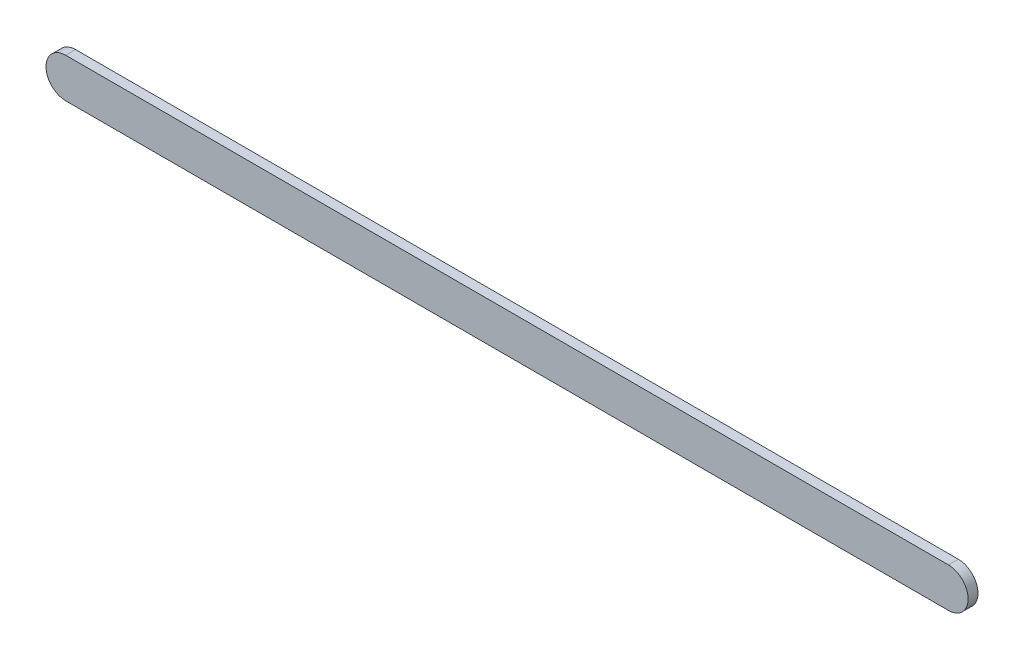
ISO-10303-21;
HEADER;
FILE_DESCRIPTION(('STEP AP214'),'2;1');
FILE_NAME('part.step','',(''),(''),'','','');
FILE_SCHEMA(('AUTOMOTIVE_DESIGN { 1 0 10303 214 1 1 1 1 }'));
ENDSEC;
DATA;
#1=APPLICATION_CONTEXT('core data for automotive mechanical design processes');
#2=APPLICATION_PROTOCOL_DEFINITION('international standard','automotive_design',2000,#1);
#3=PRODUCT_CONTEXT('',#1,'mechanical');
#4=PRODUCT('Part','Part','',(#3));
#5=PRODUCT_RELATED_PRODUCT_CATEGORY('part','',(#4));
#6=PRODUCT_DEFINITION_FORMATION('','',#4);
#7=PRODUCT_DEFINITION_CONTEXT('part definition',#1,'design');
#8=PRODUCT_DEFINITION('design','',#6,#7);
#9=PRODUCT_DEFINITION_SHAPE('','',#8);
#10=(LENGTH_UNIT() NAMED_UNIT(*) SI_UNIT(.MILLI.,.METRE.));
#11=(NAMED_UNIT(*) PLANE_ANGLE_UNIT() SI_UNIT($,.RADIAN.));
#12=(NAMED_UNIT(*) SI_UNIT($,.STERADIAN.) SOLID_ANGLE_UNIT());
#13=UNCERTAINTY_MEASURE_WITH_UNIT(LENGTH_MEASURE(1.E-05),#10,'distance_accuracy_value','');
#14=(GEOMETRIC_REPRESENTATION_CONTEXT(3) GLOBAL_UNCERTAINTY_ASSIGNED_CONTEXT((#13)) GLOBAL_UNIT_ASSIGNED_CONTEXT((#10,
#11,#12)) REPRESENTATION_CONTEXT('',''));
#15=CARTESIAN_POINT('',(0.,0.,0.));
#16=DIRECTION('',(0.,0.,1.));
#17=DIRECTION('',(1.,0.,0.));
#18=AXIS2_PLACEMENT_3D('',#15,#16,#17);
#19=CARTESIAN_POINT('',(0.,0.,5.));
#20=DIRECTION('',(0.,0.,-1.));
#21=DIRECTION('',(-1.,0.,0.));
#22=AXIS2_PLACEMENT_3D('',#19,#20,#21);
#23=CYLINDRICAL_SURFACE('',#22,20.);
#24=CARTESIAN_POINT('',(0.,0.,-5.));
#25=DIRECTION('',(0.,0.,1.));
#26=DIRECTION('',(1.,0.,0.));
#27=AXIS2_PLACEMENT_3D('',#24,#25,#26);
#28=CIRCLE('',#27,20.);
#29=CARTESIAN_POINT('',(0.,-20.,-5.));
#30=VERTEX_POINT('',#29);
#31=CARTESIAN_POINT('',(0.,20.,-5.));
#32=VERTEX_POINT('',#31);
#33=EDGE_CURVE('E97',#30,#32,#28,.T.);
#34=ORIENTED_EDGE('',*,*,#33,.T.);
#35=DIRECTION('',(0.,0.,-1.));
#36=VECTOR('',#35,1.);
#37=CARTESIAN_POINT('',(0.,20.,5.));
#38=LINE('',#37,#36);
#39=CARTESIAN_POINT('',(0.,20.,5.));
#40=VERTEX_POINT('',#39);
#41=EDGE_CURVE('E11',#40,#32,#38,.T.);
#42=ORIENTED_EDGE('',*,*,#41,.F.);
#43=CARTESIAN_POINT('',(0.,0.,5.));
#44=DIRECTION('',(0.,0.,1.));
#45=DIRECTION('',(1.,0.,0.));
#46=AXIS2_PLACEMENT_3D('',#43,#44,#45);
#47=CIRCLE('',#46,20.);
#48=CARTESIAN_POINT('',(0.,-20.,5.));
#49=VERTEX_POINT('',#48);
#50=EDGE_CURVE('E85',#49,#40,#47,.T.);
#51=ORIENTED_EDGE('',*,*,#50,.F.);
#52=DIRECTION('',(0.,0.,-1.));
#53=VECTOR('',#52,1.);
#54=CARTESIAN_POINT('',(0.,-20.,5.));
#55=LINE('',#54,#53);
#56=EDGE_CURVE('E93',#49,#30,#55,.T.);
#57=ORIENTED_EDGE('',*,*,#56,.T.);
#58=EDGE_LOOP('',(#34,#42,#51,#57));
#59=FACE_BOUND('',#58,.T.);
#60=ADVANCED_FACE('F34',(#59),#23,.T.);
#61=CARTESIAN_POINT('',(0.,20.,5.));
#62=DIRECTION('',(0.,-1.,0.));
#63=DIRECTION('',(1.,0.,0.));
#64=AXIS2_PLACEMENT_3D('',#61,#62,#63);
#65=PLANE('',#64);
#66=DIRECTION('',(-1.,0.,0.));
#67=VECTOR('',#66,1.);
#68=CARTESIAN_POINT('',(0.,20.,-5.));
#69=LINE('',#68,#67);
#70=CARTESIAN_POINT('',(-895.,19.9999999999999,-5.));
#71=VERTEX_POINT('',#70);
#72=EDGE_CURVE('E89',#32,#71,#69,.T.);
#73=ORIENTED_EDGE('',*,*,#72,.T.);
#74=DIRECTION('',(0.,0.,-1.));
#75=VECTOR('',#74,1.);
#76=CARTESIAN_POINT('',(-895.,19.9999999999999,5.));
#77=LINE('',#76,#75);
#78=CARTESIAN_POINT('',(-895.,19.9999999999999,5.));
#79=VERTEX_POINT('',#78);
#80=EDGE_CURVE('E42',#79,#71,#77,.T.);
#81=ORIENTED_EDGE('',*,*,#80,.F.);
#82=DIRECTION('',(-1.,0.,0.));
#83=VECTOR('',#82,1.);
#84=CARTESIAN_POINT('',(0.,20.,5.));
#85=LINE('',#84,#83);
#86=EDGE_CURVE('E80',#40,#79,#85,.T.);
#87=ORIENTED_EDGE('',*,*,#86,.F.);
#88=ORIENTED_EDGE('',*,*,#41,.T.);
#89=EDGE_LOOP('',(#73,#81,#87,#88));
#90=FACE_BOUND('',#89,.T.);
#91=ADVANCED_FACE('F88',(#90),#65,.F.);
#92=CARTESIAN_POINT('',(-895.,-1.34016078101287E-13,5.));
#93=DIRECTION('',(0.,0.,-1.));
#94=DIRECTION('',(-1.,0.,0.));
#95=AXIS2_PLACEMENT_3D('',#92,#93,#94);
#96=CYLINDRICAL_SURFACE('',#95,20.);
#97=CARTESIAN_POINT('',(-895.,-1.34016078101287E-13,-5.));
#98=DIRECTION('',(0.,0.,1.));
#99=DIRECTION('',(1.,0.,0.));
#100=AXIS2_PLACEMENT_3D('',#97,#98,#99);
#101=CIRCLE('',#100,20.);
#102=CARTESIAN_POINT('',(-895.,-20.0000000000001,-5.));
#103=VERTEX_POINT('',#102);
#104=EDGE_CURVE('E67',#71,#103,#101,.T.);
#105=ORIENTED_EDGE('',*,*,#104,.T.);
#106=DIRECTION('',(0.,0.,-1.));
#107=VECTOR('',#106,1.);
#108=CARTESIAN_POINT('',(-895.,-20.0000000000001,5.));
#109=LINE('',#108,#107);
#110=CARTESIAN_POINT('',(-895.,-20.0000000000001,5.));
#111=VERTEX_POINT('',#110);
#112=EDGE_CURVE('E90',#111,#103,#109,.T.);
#113=ORIENTED_EDGE('',*,*,#112,.F.);
#114=CARTESIAN_POINT('',(-895.,-1.34016078101287E-13,5.));
#115=DIRECTION('',(0.,0.,1.));
#116=DIRECTION('',(1.,0.,0.));
#117=AXIS2_PLACEMENT_3D('',#114,#115,#116);
#118=CIRCLE('',#117,20.);
#119=EDGE_CURVE('E83',#79,#111,#118,.T.);
#120=ORIENTED_EDGE('',*,*,#119,.F.);
#121=ORIENTED_EDGE('',*,*,#80,.T.);
#122=EDGE_LOOP('',(#105,#113,#120,#121));
#123=FACE_BOUND('',#122,.T.);
#124=ADVANCED_FACE('F91',(#123),#96,.T.);
#125=CARTESIAN_POINT('',(0.,-20.,5.));
#126=DIRECTION('',(0.,1.,0.));
#127=DIRECTION('',(-1.,0.,0.));
#128=AXIS2_PLACEMENT_3D('',#125,#126,#127);
#129=PLANE('',#128);
#130=DIRECTION('',(1.,0.,0.));
#131=VECTOR('',#130,1.);
#132=CARTESIAN_POINT('',(0.,-20.,-5.));
#133=LINE('',#132,#131);
#134=EDGE_CURVE('E73',#103,#30,#133,.T.);
#135=ORIENTED_EDGE('',*,*,#134,.T.);
#136=ORIENTED_EDGE('',*,*,#56,.F.);
#137=DIRECTION('',(1.,0.,0.));
#138=VECTOR('',#137,1.);
#139=CARTESIAN_POINT('',(0.,-20.,5.));
#140=LINE('',#139,#138);
#141=EDGE_CURVE('E50',#111,#49,#140,.T.);
#142=ORIENTED_EDGE('',*,*,#141,.F.);
#143=ORIENTED_EDGE('',*,*,#112,.T.);
#144=EDGE_LOOP('',(#135,#136,#142,#143));
#145=FACE_BOUND('',#144,.T.);
#146=ADVANCED_FACE('F104',(#145),#129,.F.);
#147=CARTESIAN_POINT('',(0.,0.,5.));
#148=DIRECTION('',(0.,0.,1.));
#149=DIRECTION('',(1.,0.,0.));
#150=AXIS2_PLACEMENT_3D('',#147,#148,#149);
#151=PLANE('',#150);
#152=ORIENTED_EDGE('',*,*,#50,.T.);
#153=ORIENTED_EDGE('',*,*,#86,.T.);
#154=ORIENTED_EDGE('',*,*,#119,.T.);
#155=ORIENTED_EDGE('',*,*,#141,.T.);
#156=EDGE_LOOP('',(#152,#153,#154,#155));
#157=FACE_BOUND('',#156,.T.);
#158=ADVANCED_FACE('F81',(#157),#151,.T.);
#159=CARTESIAN_POINT('',(0.,0.,-5.));
#160=DIRECTION('',(0.,0.,1.));
#161=DIRECTION('',(1.,0.,0.));
#162=AXIS2_PLACEMENT_3D('',#159,#160,#161);
#163=PLANE('',#162);
#164=ORIENTED_EDGE('',*,*,#33,.F.);
#165=ORIENTED_EDGE('',*,*,#134,.F.);
#166=ORIENTED_EDGE('',*,*,#104,.F.);
#167=ORIENTED_EDGE('',*,*,#72,.F.);
#168=EDGE_LOOP('',(#164,#165,#166,#167));
#169=FACE_BOUND('',#168,.T.);
#170=ADVANCED_FACE('F107',(#169),#163,.F.);
#171=CLOSED_SHELL('',(#60,#91,#124,#146,#158,#170));
#172=MANIFOLD_SOLID_BREP('B2',#171);
#173=ADVANCED_BREP_SHAPE_REPRESENTATION('',(#18,#172),#14);
#174=SHAPE_DEFINITION_REPRESENTATION(#9,#173);
ENDSEC;
END-ISO-10303-21;
